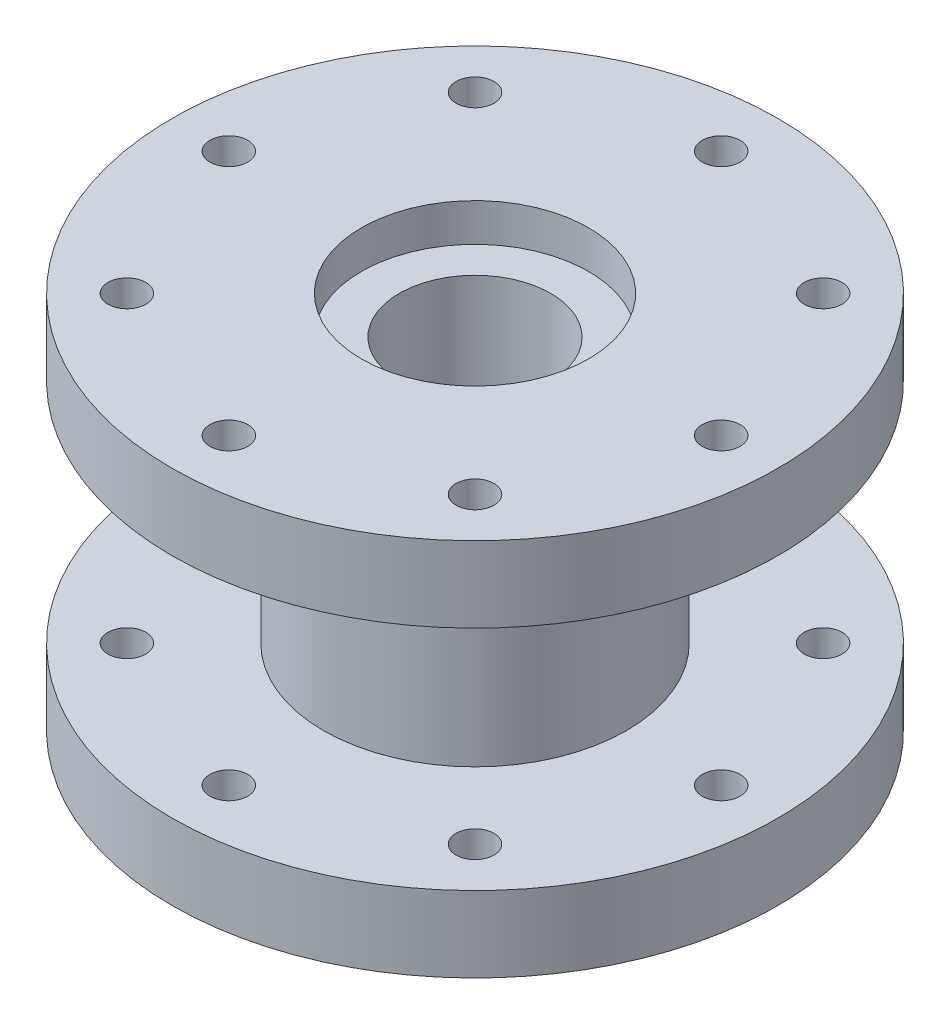
ISO-10303-21;
HEADER;
FILE_DESCRIPTION(('STEP AP214'),'2;1');
FILE_NAME('part.step','',(''),(''),'','','');
FILE_SCHEMA(('AUTOMOTIVE_DESIGN { 1 0 10303 214 1 1 1 1 }'));
ENDSEC;
DATA;
#1=APPLICATION_CONTEXT('core data for automotive mechanical design processes');
#2=APPLICATION_PROTOCOL_DEFINITION('international standard','automotive_design',2000,#1);
#3=PRODUCT_CONTEXT('',#1,'mechanical');
#4=PRODUCT('Part','Part','',(#3));
#5=PRODUCT_RELATED_PRODUCT_CATEGORY('part','',(#4));
#6=PRODUCT_DEFINITION_FORMATION('','',#4);
#7=PRODUCT_DEFINITION_CONTEXT('part definition',#1,'design');
#8=PRODUCT_DEFINITION('design','',#6,#7);
#9=PRODUCT_DEFINITION_SHAPE('','',#8);
#10=(LENGTH_UNIT() NAMED_UNIT(*) SI_UNIT(.MILLI.,.METRE.));
#11=(NAMED_UNIT(*) PLANE_ANGLE_UNIT() SI_UNIT($,.RADIAN.));
#12=(NAMED_UNIT(*) SI_UNIT($,.STERADIAN.) SOLID_ANGLE_UNIT());
#13=UNCERTAINTY_MEASURE_WITH_UNIT(LENGTH_MEASURE(1.E-05),#10,'distance_accuracy_value','');
#14=(GEOMETRIC_REPRESENTATION_CONTEXT(3) GLOBAL_UNCERTAINTY_ASSIGNED_CONTEXT((#13)) GLOBAL_UNIT_ASSIGNED_CONTEXT((#10,
#11,#12)) REPRESENTATION_CONTEXT('',''));
#15=CARTESIAN_POINT('',(0.,0.,0.));
#16=DIRECTION('',(0.,0.,1.));
#17=DIRECTION('',(1.,0.,0.));
#18=AXIS2_PLACEMENT_3D('',#15,#16,#17);
#19=CARTESIAN_POINT('',(19.05,57.15,0.));
#20=DIRECTION('',(0.,-1.,0.));
#21=DIRECTION('',(0.,0.,-1.));
#22=AXIS2_PLACEMENT_3D('',#19,#20,#21);
#23=PLANE('',#22);
#24=CARTESIAN_POINT('',(0.,57.15,0.));
#25=DIRECTION('',(0.,1.,0.));
#26=DIRECTION('',(0.,0.,1.));
#27=AXIS2_PLACEMENT_3D('',#24,#25,#26);
#28=CIRCLE('',#27,12.7);
#29=CARTESIAN_POINT('',(0.,57.15,12.7));
#30=VERTEX_POINT('',#29);
#31=EDGE_CURVE('E11',#30,#30,#28,.T.);
#32=ORIENTED_EDGE('',*,*,#31,.F.);
#33=EDGE_LOOP('',(#32));
#34=FACE_BOUND('',#33,.T.);
#35=CARTESIAN_POINT('',(0.,57.15,0.));
#36=DIRECTION('',(0.,1.,0.));
#37=DIRECTION('',(0.,0.,1.));
#38=AXIS2_PLACEMENT_3D('',#35,#36,#37);
#39=CIRCLE('',#38,19.05);
#40=CARTESIAN_POINT('',(0.,57.15,19.05));
#41=VERTEX_POINT('',#40);
#42=EDGE_CURVE('E110',#41,#41,#39,.T.);
#43=ORIENTED_EDGE('',*,*,#42,.T.);
#44=EDGE_LOOP('',(#43));
#45=FACE_BOUND('',#44,.T.);
#46=ADVANCED_FACE('F70',(#34,#45),#23,.F.);
#47=CARTESIAN_POINT('',(0.,117.328630251752,0.));
#48=DIRECTION('',(0.,1.,0.));
#49=DIRECTION('',(0.,0.,1.));
#50=AXIS2_PLACEMENT_3D('',#47,#48,#49);
#51=CYLINDRICAL_SURFACE('',#50,12.7);
#52=CARTESIAN_POINT('',(0.,6.34999999999999,0.));
#53=DIRECTION('',(0.,1.,0.));
#54=DIRECTION('',(0.,0.,1.));
#55=AXIS2_PLACEMENT_3D('',#52,#53,#54);
#56=CIRCLE('',#55,12.7);
#57=CARTESIAN_POINT('',(0.,6.34999999999999,12.7));
#58=VERTEX_POINT('',#57);
#59=EDGE_CURVE('E76',#58,#58,#56,.T.);
#60=ORIENTED_EDGE('',*,*,#59,.F.);
#61=EDGE_LOOP('',(#60));
#62=FACE_BOUND('',#61,.T.);
#63=ORIENTED_EDGE('',*,*,#31,.T.);
#64=EDGE_LOOP('',(#63));
#65=FACE_BOUND('',#64,.T.);
#66=ADVANCED_FACE('F276',(#62,#65),#51,.F.);
#67=CARTESIAN_POINT('',(12.7,6.35,0.));
#68=DIRECTION('',(0.,1.,0.));
#69=DIRECTION('',(0.,0.,1.));
#70=AXIS2_PLACEMENT_3D('',#67,#68,#69);
#71=PLANE('',#70);
#72=CARTESIAN_POINT('',(0.,6.34999999999999,0.));
#73=DIRECTION('',(0.,1.,0.));
#74=DIRECTION('',(0.,0.,1.));
#75=AXIS2_PLACEMENT_3D('',#72,#73,#74);
#76=CIRCLE('',#75,19.05);
#77=CARTESIAN_POINT('',(0.,6.34999999999999,19.05));
#78=VERTEX_POINT('',#77);
#79=EDGE_CURVE('E80',#78,#78,#76,.T.);
#80=ORIENTED_EDGE('',*,*,#79,.F.);
#81=EDGE_LOOP('',(#80));
#82=FACE_BOUND('',#81,.T.);
#83=ORIENTED_EDGE('',*,*,#59,.T.);
#84=EDGE_LOOP('',(#83));
#85=FACE_BOUND('',#84,.T.);
#86=ADVANCED_FACE('F271',(#82,#85),#71,.F.);
#87=CARTESIAN_POINT('',(0.,117.328630251752,0.));
#88=DIRECTION('',(0.,1.,0.));
#89=DIRECTION('',(0.,0.,1.));
#90=AXIS2_PLACEMENT_3D('',#87,#88,#89);
#91=CYLINDRICAL_SURFACE('',#90,19.05);
#92=CARTESIAN_POINT('',(0.,0.,0.));
#93=DIRECTION('',(0.,1.,0.));
#94=DIRECTION('',(0.,0.,1.));
#95=AXIS2_PLACEMENT_3D('',#92,#93,#94);
#96=CIRCLE('',#95,19.05);
#97=CARTESIAN_POINT('',(0.,0.,19.05));
#98=VERTEX_POINT('',#97);
#99=EDGE_CURVE('E84',#98,#98,#96,.T.);
#100=ORIENTED_EDGE('',*,*,#99,.F.);
#101=EDGE_LOOP('',(#100));
#102=FACE_BOUND('',#101,.T.);
#103=ORIENTED_EDGE('',*,*,#79,.T.);
#104=EDGE_LOOP('',(#103));
#105=FACE_BOUND('',#104,.T.);
#106=ADVANCED_FACE('F264',(#102,#105),#91,.F.);
#107=CARTESIAN_POINT('',(19.05,0.,0.));
#108=DIRECTION('',(0.,1.,0.));
#109=DIRECTION('',(0.,0.,1.));
#110=AXIS2_PLACEMENT_3D('',#107,#108,#109);
#111=PLANE('',#110);
#112=CARTESIAN_POINT('',(4.32332676782251E-13,0.,-41.275));
#113=DIRECTION('',(0.,1.,0.));
#114=DIRECTION('',(0.,0.,1.));
#115=AXIS2_PLACEMENT_3D('',#112,#113,#114);
#116=CIRCLE('',#115,3.17499999999999);
#117=CARTESIAN_POINT('',(4.32332676782251E-13,0.,-38.1));
#118=VERTEX_POINT('',#117);
#119=EDGE_CURVE('E187',#118,#118,#116,.T.);
#120=ORIENTED_EDGE('',*,*,#119,.T.);
#121=EDGE_LOOP('',(#120));
#122=FACE_BOUND('',#121,.T.);
#123=CARTESIAN_POINT('',(29.1858323934751,0.,-29.1858323934744));
#124=DIRECTION('',(0.,1.,0.));
#125=DIRECTION('',(0.,0.,1.));
#126=AXIS2_PLACEMENT_3D('',#123,#124,#125);
#127=CIRCLE('',#126,3.175);
#128=CARTESIAN_POINT('',(29.1858323934751,0.,-26.0108323934744));
#129=VERTEX_POINT('',#128);
#130=EDGE_CURVE('E181',#129,#129,#127,.T.);
#131=ORIENTED_EDGE('',*,*,#130,.T.);
#132=EDGE_LOOP('',(#131));
#133=FACE_BOUND('',#132,.T.);
#134=CARTESIAN_POINT('',(-1.4411089226075E-13,0.,41.275));
#135=DIRECTION('',(0.,1.,0.));
#136=DIRECTION('',(0.,0.,1.));
#137=AXIS2_PLACEMENT_3D('',#134,#135,#136);
#138=CIRCLE('',#137,3.17499999999999);
#139=CARTESIAN_POINT('',(-1.4411089226075E-13,0.,44.45));
#140=VERTEX_POINT('',#139);
#141=EDGE_CURVE('E175',#140,#140,#138,.T.);
#142=ORIENTED_EDGE('',*,*,#141,.T.);
#143=EDGE_LOOP('',(#142));
#144=FACE_BOUND('',#143,.T.);
#145=CARTESIAN_POINT('',(-41.275,0.,-2.88221784521501E-13));
#146=DIRECTION('',(0.,1.,0.));
#147=DIRECTION('',(0.,0.,1.));
#148=AXIS2_PLACEMENT_3D('',#145,#146,#147);
#149=CIRCLE('',#148,3.175);
#150=CARTESIAN_POINT('',(-41.275,0.,3.17499999999971));
#151=VERTEX_POINT('',#150);
#152=EDGE_CURVE('E168',#151,#151,#149,.T.);
#153=ORIENTED_EDGE('',*,*,#152,.T.);
#154=EDGE_LOOP('',(#153));
#155=FACE_BOUND('',#154,.T.);
#156=CARTESIAN_POINT('',(-29.1858323934749,0.,29.1858323934746));
#157=DIRECTION('',(0.,1.,0.));
#158=DIRECTION('',(0.,0.,1.));
#159=AXIS2_PLACEMENT_3D('',#156,#157,#158);
#160=CIRCLE('',#159,3.175);
#161=CARTESIAN_POINT('',(-29.1858323934749,0.,32.3608323934746));
#162=VERTEX_POINT('',#161);
#163=EDGE_CURVE('E204',#162,#162,#160,.T.);
#164=ORIENTED_EDGE('',*,*,#163,.T.);
#165=EDGE_LOOP('',(#164));
#166=FACE_BOUND('',#165,.T.);
#167=CARTESIAN_POINT('',(29.1858323934747,0.,29.1858323934748));
#168=DIRECTION('',(0.,1.,0.));
#169=DIRECTION('',(0.,0.,1.));
#170=AXIS2_PLACEMENT_3D('',#167,#168,#169);
#171=CIRCLE('',#170,3.175);
#172=CARTESIAN_POINT('',(29.1858323934747,0.,32.3608323934748));
#173=VERTEX_POINT('',#172);
#174=EDGE_CURVE('E198',#173,#173,#171,.T.);
#175=ORIENTED_EDGE('',*,*,#174,.T.);
#176=EDGE_LOOP('',(#175));
#177=FACE_BOUND('',#176,.T.);
#178=CARTESIAN_POINT('',(41.275,0.,0.));
#179=DIRECTION('',(0.,1.,0.));
#180=DIRECTION('',(0.,0.,1.));
#181=AXIS2_PLACEMENT_3D('',#178,#179,#180);
#182=CIRCLE('',#181,3.175);
#183=CARTESIAN_POINT('',(41.275,0.,3.175));
#184=VERTEX_POINT('',#183);
#185=EDGE_CURVE('E192',#184,#184,#182,.T.);
#186=ORIENTED_EDGE('',*,*,#185,.T.);
#187=EDGE_LOOP('',(#186));
#188=FACE_BOUND('',#187,.T.);
#189=CARTESIAN_POINT('',(-29.1858323934745,0.,-29.185832393475));
#190=DIRECTION('',(0.,1.,0.));
#191=DIRECTION('',(0.,0.,1.));
#192=AXIS2_PLACEMENT_3D('',#189,#190,#191);
#193=CIRCLE('',#192,3.175);
#194=CARTESIAN_POINT('',(-29.1858323934745,0.,-26.010832393475));
#195=VERTEX_POINT('',#194);
#196=EDGE_CURVE('E161',#195,#195,#193,.T.);
#197=ORIENTED_EDGE('',*,*,#196,.T.);
#198=EDGE_LOOP('',(#197));
#199=FACE_BOUND('',#198,.T.);
#200=CARTESIAN_POINT('',(0.,0.,0.));
#201=DIRECTION('',(0.,1.,0.));
#202=DIRECTION('',(0.,0.,1.));
#203=AXIS2_PLACEMENT_3D('',#200,#201,#202);
#204=CIRCLE('',#203,50.8);
#205=CARTESIAN_POINT('',(0.,0.,50.8));
#206=VERTEX_POINT('',#205);
#207=EDGE_CURVE('E89',#206,#206,#204,.T.);
#208=ORIENTED_EDGE('',*,*,#207,.F.);
#209=EDGE_LOOP('',(#208));
#210=FACE_BOUND('',#209,.T.);
#211=ORIENTED_EDGE('',*,*,#99,.T.);
#212=EDGE_LOOP('',(#211));
#213=FACE_BOUND('',#212,.T.);
#214=ADVANCED_FACE('F258',(#122,#133,#144,#155,#166,#177,#188,#199,#210,#213),#111,.F.);
#215=CARTESIAN_POINT('',(0.,117.328630251752,0.));
#216=DIRECTION('',(0.,1.,0.));
#217=DIRECTION('',(0.,0.,1.));
#218=AXIS2_PLACEMENT_3D('',#215,#216,#217);
#219=CYLINDRICAL_SURFACE('',#218,50.8);
#220=CARTESIAN_POINT('',(0.,12.7,0.));
#221=DIRECTION('',(0.,1.,0.));
#222=DIRECTION('',(0.,0.,1.));
#223=AXIS2_PLACEMENT_3D('',#220,#221,#222);
#224=CIRCLE('',#223,50.8);
#225=CARTESIAN_POINT('',(0.,12.7,50.8));
#226=VERTEX_POINT('',#225);
#227=EDGE_CURVE('E92',#226,#226,#224,.T.);
#228=ORIENTED_EDGE('',*,*,#227,.F.);
#229=EDGE_LOOP('',(#228));
#230=FACE_BOUND('',#229,.T.);
#231=ORIENTED_EDGE('',*,*,#207,.T.);
#232=EDGE_LOOP('',(#231));
#233=FACE_BOUND('',#232,.T.);
#234=ADVANCED_FACE('F251',(#230,#233),#219,.T.);
#235=CARTESIAN_POINT('',(50.8,12.7,0.));
#236=DIRECTION('',(0.,-1.,0.));
#237=DIRECTION('',(0.,0.,-1.));
#238=AXIS2_PLACEMENT_3D('',#235,#236,#237);
#239=PLANE('',#238);
#240=CARTESIAN_POINT('',(4.32332676782251E-13,12.7,-41.275));
#241=DIRECTION('',(0.,-1.,0.));
#242=DIRECTION('',(0.,0.,-1.));
#243=AXIS2_PLACEMENT_3D('',#240,#241,#242);
#244=CIRCLE('',#243,3.17499999999999);
#245=CARTESIAN_POINT('',(4.32332676782251E-13,12.7,-44.45));
#246=VERTEX_POINT('',#245);
#247=EDGE_CURVE('E113',#246,#246,#244,.T.);
#248=ORIENTED_EDGE('',*,*,#247,.T.);
#249=EDGE_LOOP('',(#248));
#250=FACE_BOUND('',#249,.T.);
#251=CARTESIAN_POINT('',(29.1858323934751,12.7,-29.1858323934744));
#252=DIRECTION('',(0.,-1.,0.));
#253=DIRECTION('',(0.,0.,-1.));
#254=AXIS2_PLACEMENT_3D('',#251,#252,#253);
#255=CIRCLE('',#254,3.175);
#256=CARTESIAN_POINT('',(29.1858323934751,12.7,-32.3608323934744));
#257=VERTEX_POINT('',#256);
#258=EDGE_CURVE('E119',#257,#257,#255,.T.);
#259=ORIENTED_EDGE('',*,*,#258,.T.);
#260=EDGE_LOOP('',(#259));
#261=FACE_BOUND('',#260,.T.);
#262=CARTESIAN_POINT('',(-1.4411089226075E-13,12.7,41.275));
#263=DIRECTION('',(0.,-1.,0.));
#264=DIRECTION('',(0.,0.,-1.));
#265=AXIS2_PLACEMENT_3D('',#262,#263,#264);
#266=CIRCLE('',#265,3.17499999999999);
#267=CARTESIAN_POINT('',(-1.4411089226075E-13,12.7,38.1));
#268=VERTEX_POINT('',#267);
#269=EDGE_CURVE('E125',#268,#268,#266,.T.);
#270=ORIENTED_EDGE('',*,*,#269,.T.);
#271=EDGE_LOOP('',(#270));
#272=FACE_BOUND('',#271,.T.);
#273=CARTESIAN_POINT('',(-41.275,12.7,-2.88221784521501E-13));
#274=DIRECTION('',(0.,-1.,0.));
#275=DIRECTION('',(0.,0.,-1.));
#276=AXIS2_PLACEMENT_3D('',#273,#274,#275);
#277=CIRCLE('',#276,3.175);
#278=CARTESIAN_POINT('',(-41.275,12.7,-3.17500000000029));
#279=VERTEX_POINT('',#278);
#280=EDGE_CURVE('E131',#279,#279,#277,.T.);
#281=ORIENTED_EDGE('',*,*,#280,.T.);
#282=EDGE_LOOP('',(#281));
#283=FACE_BOUND('',#282,.T.);
#284=CARTESIAN_POINT('',(-29.1858323934749,12.7,29.1858323934746));
#285=DIRECTION('',(0.,-1.,0.));
#286=DIRECTION('',(0.,0.,-1.));
#287=AXIS2_PLACEMENT_3D('',#284,#285,#286);
#288=CIRCLE('',#287,3.175);
#289=CARTESIAN_POINT('',(-29.1858323934749,12.7,26.0108323934746));
#290=VERTEX_POINT('',#289);
#291=EDGE_CURVE('E137',#290,#290,#288,.T.);
#292=ORIENTED_EDGE('',*,*,#291,.T.);
#293=EDGE_LOOP('',(#292));
#294=FACE_BOUND('',#293,.T.);
#295=CARTESIAN_POINT('',(29.1858323934747,12.7,29.1858323934748));
#296=DIRECTION('',(0.,-1.,0.));
#297=DIRECTION('',(0.,0.,-1.));
#298=AXIS2_PLACEMENT_3D('',#295,#296,#297);
#299=CIRCLE('',#298,3.175);
#300=CARTESIAN_POINT('',(29.1858323934747,12.7,26.0108323934748));
#301=VERTEX_POINT('',#300);
#302=EDGE_CURVE('E143',#301,#301,#299,.T.);
#303=ORIENTED_EDGE('',*,*,#302,.T.);
#304=EDGE_LOOP('',(#303));
#305=FACE_BOUND('',#304,.T.);
#306=CARTESIAN_POINT('',(41.275,12.7,0.));
#307=DIRECTION('',(0.,-1.,0.));
#308=DIRECTION('',(0.,0.,-1.));
#309=AXIS2_PLACEMENT_3D('',#306,#307,#308);
#310=CIRCLE('',#309,3.175);
#311=CARTESIAN_POINT('',(41.275,12.7,-3.175));
#312=VERTEX_POINT('',#311);
#313=EDGE_CURVE('E149',#312,#312,#310,.T.);
#314=ORIENTED_EDGE('',*,*,#313,.T.);
#315=EDGE_LOOP('',(#314));
#316=FACE_BOUND('',#315,.T.);
#317=CARTESIAN_POINT('',(-29.1858323934745,12.7,-29.185832393475));
#318=DIRECTION('',(0.,-1.,0.));
#319=DIRECTION('',(0.,0.,-1.));
#320=AXIS2_PLACEMENT_3D('',#317,#318,#319);
#321=CIRCLE('',#320,3.175);
#322=CARTESIAN_POINT('',(-29.1858323934745,12.7,-32.360832393475));
#323=VERTEX_POINT('',#322);
#324=EDGE_CURVE('E155',#323,#323,#321,.T.);
#325=ORIENTED_EDGE('',*,*,#324,.T.);
#326=EDGE_LOOP('',(#325));
#327=FACE_BOUND('',#326,.T.);
#328=CARTESIAN_POINT('',(0.,12.7,0.));
#329=DIRECTION('',(0.,1.,0.));
#330=DIRECTION('',(0.,0.,1.));
#331=AXIS2_PLACEMENT_3D('',#328,#329,#330);
#332=CIRCLE('',#331,25.4);
#333=CARTESIAN_POINT('',(0.,12.7,25.4));
#334=VERTEX_POINT('',#333);
#335=EDGE_CURVE('E95',#334,#334,#332,.T.);
#336=ORIENTED_EDGE('',*,*,#335,.F.);
#337=EDGE_LOOP('',(#336));
#338=FACE_BOUND('',#337,.T.);
#339=ORIENTED_EDGE('',*,*,#227,.T.);
#340=EDGE_LOOP('',(#339));
#341=FACE_BOUND('',#340,.T.);
#342=ADVANCED_FACE('F245',(#250,#261,#272,#283,#294,#305,#316,#327,#338,#341),#239,.F.);
#343=CARTESIAN_POINT('',(0.,117.328630251752,0.));
#344=DIRECTION('',(0.,1.,0.));
#345=DIRECTION('',(0.,0.,1.));
#346=AXIS2_PLACEMENT_3D('',#343,#344,#345);
#347=CYLINDRICAL_SURFACE('',#346,25.4);
#348=CARTESIAN_POINT('',(0.,50.8,0.));
#349=DIRECTION('',(0.,1.,0.));
#350=DIRECTION('',(0.,0.,1.));
#351=AXIS2_PLACEMENT_3D('',#348,#349,#350);
#352=CIRCLE('',#351,25.4);
#353=CARTESIAN_POINT('',(0.,50.8,25.4));
#354=VERTEX_POINT('',#353);
#355=EDGE_CURVE('E98',#354,#354,#352,.T.);
#356=ORIENTED_EDGE('',*,*,#355,.F.);
#357=EDGE_LOOP('',(#356));
#358=FACE_BOUND('',#357,.T.);
#359=ORIENTED_EDGE('',*,*,#335,.T.);
#360=EDGE_LOOP('',(#359));
#361=FACE_BOUND('',#360,.T.);
#362=ADVANCED_FACE('F238',(#358,#361),#347,.T.);
#363=CARTESIAN_POINT('',(25.4,50.8,0.));
#364=DIRECTION('',(0.,1.,0.));
#365=DIRECTION('',(0.,0.,1.));
#366=AXIS2_PLACEMENT_3D('',#363,#364,#365);
#367=PLANE('',#366);
#368=CARTESIAN_POINT('',(4.32332676782251E-13,50.8,-41.275));
#369=DIRECTION('',(0.,1.,0.));
#370=DIRECTION('',(0.,0.,1.));
#371=AXIS2_PLACEMENT_3D('',#368,#369,#370);
#372=CIRCLE('',#371,3.17499999999999);
#373=CARTESIAN_POINT('',(4.32332676782251E-13,50.8,-38.1));
#374=VERTEX_POINT('',#373);
#375=EDGE_CURVE('E116',#374,#374,#372,.T.);
#376=ORIENTED_EDGE('',*,*,#375,.T.);
#377=EDGE_LOOP('',(#376));
#378=FACE_BOUND('',#377,.T.);
#379=CARTESIAN_POINT('',(29.1858323934751,50.8,-29.1858323934744));
#380=DIRECTION('',(0.,1.,0.));
#381=DIRECTION('',(0.,0.,1.));
#382=AXIS2_PLACEMENT_3D('',#379,#380,#381);
#383=CIRCLE('',#382,3.175);
#384=CARTESIAN_POINT('',(29.1858323934751,50.8,-26.0108323934744));
#385=VERTEX_POINT('',#384);
#386=EDGE_CURVE('E122',#385,#385,#383,.T.);
#387=ORIENTED_EDGE('',*,*,#386,.T.);
#388=EDGE_LOOP('',(#387));
#389=FACE_BOUND('',#388,.T.);
#390=CARTESIAN_POINT('',(-1.4411089226075E-13,50.8,41.275));
#391=DIRECTION('',(0.,1.,0.));
#392=DIRECTION('',(0.,0.,1.));
#393=AXIS2_PLACEMENT_3D('',#390,#391,#392);
#394=CIRCLE('',#393,3.17499999999999);
#395=CARTESIAN_POINT('',(-1.4411089226075E-13,50.8,44.45));
#396=VERTEX_POINT('',#395);
#397=EDGE_CURVE('E128',#396,#396,#394,.T.);
#398=ORIENTED_EDGE('',*,*,#397,.T.);
#399=EDGE_LOOP('',(#398));
#400=FACE_BOUND('',#399,.T.);
#401=CARTESIAN_POINT('',(-41.275,50.8,-2.88221784521501E-13));
#402=DIRECTION('',(0.,1.,0.));
#403=DIRECTION('',(0.,0.,1.));
#404=AXIS2_PLACEMENT_3D('',#401,#402,#403);
#405=CIRCLE('',#404,3.175);
#406=CARTESIAN_POINT('',(-41.275,50.8,3.17499999999971));
#407=VERTEX_POINT('',#406);
#408=EDGE_CURVE('E134',#407,#407,#405,.T.);
#409=ORIENTED_EDGE('',*,*,#408,.T.);
#410=EDGE_LOOP('',(#409));
#411=FACE_BOUND('',#410,.T.);
#412=CARTESIAN_POINT('',(-29.1858323934749,50.8,29.1858323934746));
#413=DIRECTION('',(0.,1.,0.));
#414=DIRECTION('',(0.,0.,1.));
#415=AXIS2_PLACEMENT_3D('',#412,#413,#414);
#416=CIRCLE('',#415,3.175);
#417=CARTESIAN_POINT('',(-29.1858323934749,50.8,32.3608323934746));
#418=VERTEX_POINT('',#417);
#419=EDGE_CURVE('E140',#418,#418,#416,.T.);
#420=ORIENTED_EDGE('',*,*,#419,.T.);
#421=EDGE_LOOP('',(#420));
#422=FACE_BOUND('',#421,.T.);
#423=CARTESIAN_POINT('',(29.1858323934747,50.8,29.1858323934748));
#424=DIRECTION('',(0.,1.,0.));
#425=DIRECTION('',(0.,0.,1.));
#426=AXIS2_PLACEMENT_3D('',#423,#424,#425);
#427=CIRCLE('',#426,3.175);
#428=CARTESIAN_POINT('',(29.1858323934747,50.8,32.3608323934748));
#429=VERTEX_POINT('',#428);
#430=EDGE_CURVE('E146',#429,#429,#427,.T.);
#431=ORIENTED_EDGE('',*,*,#430,.T.);
#432=EDGE_LOOP('',(#431));
#433=FACE_BOUND('',#432,.T.);
#434=CARTESIAN_POINT('',(41.275,50.8,0.));
#435=DIRECTION('',(0.,1.,0.));
#436=DIRECTION('',(0.,0.,1.));
#437=AXIS2_PLACEMENT_3D('',#434,#435,#436);
#438=CIRCLE('',#437,3.175);
#439=CARTESIAN_POINT('',(41.275,50.8,3.175));
#440=VERTEX_POINT('',#439);
#441=EDGE_CURVE('E152',#440,#440,#438,.T.);
#442=ORIENTED_EDGE('',*,*,#441,.T.);
#443=EDGE_LOOP('',(#442));
#444=FACE_BOUND('',#443,.T.);
#445=CARTESIAN_POINT('',(-29.1858323934745,50.8,-29.185832393475));
#446=DIRECTION('',(0.,1.,0.));
#447=DIRECTION('',(0.,0.,1.));
#448=AXIS2_PLACEMENT_3D('',#445,#446,#447);
#449=CIRCLE('',#448,3.175);
#450=CARTESIAN_POINT('',(-29.1858323934745,50.8,-26.010832393475));
#451=VERTEX_POINT('',#450);
#452=EDGE_CURVE('E158',#451,#451,#449,.T.);
#453=ORIENTED_EDGE('',*,*,#452,.T.);
#454=EDGE_LOOP('',(#453));
#455=FACE_BOUND('',#454,.T.);
#456=CARTESIAN_POINT('',(0.,50.8,0.));
#457=DIRECTION('',(0.,1.,0.));
#458=DIRECTION('',(0.,0.,1.));
#459=AXIS2_PLACEMENT_3D('',#456,#457,#458);
#460=CIRCLE('',#459,50.8);
#461=CARTESIAN_POINT('',(0.,50.8,50.8));
#462=VERTEX_POINT('',#461);
#463=EDGE_CURVE('E101',#462,#462,#460,.T.);
#464=ORIENTED_EDGE('',*,*,#463,.F.);
#465=EDGE_LOOP('',(#464));
#466=FACE_BOUND('',#465,.T.);
#467=ORIENTED_EDGE('',*,*,#355,.T.);
#468=EDGE_LOOP('',(#467));
#469=FACE_BOUND('',#468,.T.);
#470=ADVANCED_FACE('F232',(#378,#389,#400,#411,#422,#433,#444,#455,#466,#469),#367,.F.);
#471=CARTESIAN_POINT('',(0.,117.328630251752,0.));
#472=DIRECTION('',(0.,1.,0.));
#473=DIRECTION('',(0.,0.,1.));
#474=AXIS2_PLACEMENT_3D('',#471,#472,#473);
#475=CYLINDRICAL_SURFACE('',#474,50.8);
#476=CARTESIAN_POINT('',(0.,63.5,0.));
#477=DIRECTION('',(0.,1.,0.));
#478=DIRECTION('',(0.,0.,1.));
#479=AXIS2_PLACEMENT_3D('',#476,#477,#478);
#480=CIRCLE('',#479,50.8);
#481=CARTESIAN_POINT('',(0.,63.5,50.8));
#482=VERTEX_POINT('',#481);
#483=EDGE_CURVE('E104',#482,#482,#480,.T.);
#484=ORIENTED_EDGE('',*,*,#483,.F.);
#485=EDGE_LOOP('',(#484));
#486=FACE_BOUND('',#485,.T.);
#487=ORIENTED_EDGE('',*,*,#463,.T.);
#488=EDGE_LOOP('',(#487));
#489=FACE_BOUND('',#488,.T.);
#490=ADVANCED_FACE('F217',(#486,#489),#475,.T.);
#491=CARTESIAN_POINT('',(50.8,63.5,0.));
#492=DIRECTION('',(0.,-1.,0.));
#493=DIRECTION('',(0.,0.,-1.));
#494=AXIS2_PLACEMENT_3D('',#491,#492,#493);
#495=PLANE('',#494);
#496=CARTESIAN_POINT('',(4.32332676782251E-13,63.5,-41.275));
#497=DIRECTION('',(0.,1.,0.));
#498=DIRECTION('',(0.,0.,1.));
#499=AXIS2_PLACEMENT_3D('',#496,#497,#498);
#500=CIRCLE('',#499,3.17499999999999);
#501=CARTESIAN_POINT('',(4.32332676782251E-13,63.5,-38.1));
#502=VERTEX_POINT('',#501);
#503=EDGE_CURVE('E165',#502,#502,#500,.T.);
#504=ORIENTED_EDGE('',*,*,#503,.F.);
#505=EDGE_LOOP('',(#504));
#506=FACE_BOUND('',#505,.T.);
#507=CARTESIAN_POINT('',(29.1858323934751,63.5,-29.1858323934744));
#508=DIRECTION('',(0.,1.,0.));
#509=DIRECTION('',(0.,0.,1.));
#510=AXIS2_PLACEMENT_3D('',#507,#508,#509);
#511=CIRCLE('',#510,3.175);
#512=CARTESIAN_POINT('',(29.1858323934751,63.5,-26.0108323934744));
#513=VERTEX_POINT('',#512);
#514=EDGE_CURVE('E184',#513,#513,#511,.T.);
#515=ORIENTED_EDGE('',*,*,#514,.F.);
#516=EDGE_LOOP('',(#515));
#517=FACE_BOUND('',#516,.T.);
#518=CARTESIAN_POINT('',(-1.4411089226075E-13,63.5,41.275));
#519=DIRECTION('',(0.,1.,0.));
#520=DIRECTION('',(0.,0.,1.));
#521=AXIS2_PLACEMENT_3D('',#518,#519,#520);
#522=CIRCLE('',#521,3.17499999999999);
#523=CARTESIAN_POINT('',(-1.4411089226075E-13,63.5,44.45));
#524=VERTEX_POINT('',#523);
#525=EDGE_CURVE('E178',#524,#524,#522,.T.);
#526=ORIENTED_EDGE('',*,*,#525,.F.);
#527=EDGE_LOOP('',(#526));
#528=FACE_BOUND('',#527,.T.);
#529=CARTESIAN_POINT('',(-41.275,63.5,-2.88221784521501E-13));
#530=DIRECTION('',(0.,1.,0.));
#531=DIRECTION('',(0.,0.,1.));
#532=AXIS2_PLACEMENT_3D('',#529,#530,#531);
#533=CIRCLE('',#532,3.175);
#534=CARTESIAN_POINT('',(-41.275,63.5,3.17499999999971));
#535=VERTEX_POINT('',#534);
#536=EDGE_CURVE('E171',#535,#535,#533,.T.);
#537=ORIENTED_EDGE('',*,*,#536,.F.);
#538=EDGE_LOOP('',(#537));
#539=FACE_BOUND('',#538,.T.);
#540=CARTESIAN_POINT('',(-29.1858323934749,63.5,29.1858323934746));
#541=DIRECTION('',(0.,1.,0.));
#542=DIRECTION('',(0.,0.,1.));
#543=AXIS2_PLACEMENT_3D('',#540,#541,#542);
#544=CIRCLE('',#543,3.175);
#545=CARTESIAN_POINT('',(-29.1858323934749,63.5,32.3608323934746));
#546=VERTEX_POINT('',#545);
#547=EDGE_CURVE('E172',#546,#546,#544,.T.);
#548=ORIENTED_EDGE('',*,*,#547,.F.);
#549=EDGE_LOOP('',(#548));
#550=FACE_BOUND('',#549,.T.);
#551=CARTESIAN_POINT('',(29.1858323934747,63.5,29.1858323934748));
#552=DIRECTION('',(0.,1.,0.));
#553=DIRECTION('',(0.,0.,1.));
#554=AXIS2_PLACEMENT_3D('',#551,#552,#553);
#555=CIRCLE('',#554,3.175);
#556=CARTESIAN_POINT('',(29.1858323934747,63.5,32.3608323934748));
#557=VERTEX_POINT('',#556);
#558=EDGE_CURVE('E201',#557,#557,#555,.T.);
#559=ORIENTED_EDGE('',*,*,#558,.F.);
#560=EDGE_LOOP('',(#559));
#561=FACE_BOUND('',#560,.T.);
#562=CARTESIAN_POINT('',(41.275,63.5,0.));
#563=DIRECTION('',(0.,1.,0.));
#564=DIRECTION('',(0.,0.,1.));
#565=AXIS2_PLACEMENT_3D('',#562,#563,#564);
#566=CIRCLE('',#565,3.175);
#567=CARTESIAN_POINT('',(41.275,63.5,3.175));
#568=VERTEX_POINT('',#567);
#569=EDGE_CURVE('E195',#568,#568,#566,.T.);
#570=ORIENTED_EDGE('',*,*,#569,.F.);
#571=EDGE_LOOP('',(#570));
#572=FACE_BOUND('',#571,.T.);
#573=CARTESIAN_POINT('',(-29.1858323934745,63.5,-29.185832393475));
#574=DIRECTION('',(0.,1.,0.));
#575=DIRECTION('',(0.,0.,1.));
#576=AXIS2_PLACEMENT_3D('',#573,#574,#575);
#577=CIRCLE('',#576,3.175);
#578=CARTESIAN_POINT('',(-29.1858323934745,63.5,-26.010832393475));
#579=VERTEX_POINT('',#578);
#580=EDGE_CURVE('E162',#579,#579,#577,.T.);
#581=ORIENTED_EDGE('',*,*,#580,.F.);
#582=EDGE_LOOP('',(#581));
#583=FACE_BOUND('',#582,.T.);
#584=CARTESIAN_POINT('',(0.,63.5,0.));
#585=DIRECTION('',(0.,1.,0.));
#586=DIRECTION('',(0.,0.,1.));
#587=AXIS2_PLACEMENT_3D('',#584,#585,#586);
#588=CIRCLE('',#587,19.05);
#589=CARTESIAN_POINT('',(0.,63.5,19.05));
#590=VERTEX_POINT('',#589);
#591=EDGE_CURVE('E107',#590,#590,#588,.T.);
#592=ORIENTED_EDGE('',*,*,#591,.F.);
#593=EDGE_LOOP('',(#592));
#594=FACE_BOUND('',#593,.T.);
#595=ORIENTED_EDGE('',*,*,#483,.T.);
#596=EDGE_LOOP('',(#595));
#597=FACE_BOUND('',#596,.T.);
#598=ADVANCED_FACE('F213',(#506,#517,#528,#539,#550,#561,#572,#583,#594,#597),#495,.F.);
#599=CARTESIAN_POINT('',(0.,117.328630251752,0.));
#600=DIRECTION('',(0.,1.,0.));
#601=DIRECTION('',(0.,0.,1.));
#602=AXIS2_PLACEMENT_3D('',#599,#600,#601);
#603=CYLINDRICAL_SURFACE('',#602,19.05);
#604=ORIENTED_EDGE('',*,*,#42,.F.);
#605=EDGE_LOOP('',(#604));
#606=FACE_BOUND('',#605,.T.);
#607=ORIENTED_EDGE('',*,*,#591,.T.);
#608=EDGE_LOOP('',(#607));
#609=FACE_BOUND('',#608,.T.);
#610=ADVANCED_FACE('F216',(#606,#609),#603,.F.);
#611=CARTESIAN_POINT('',(-29.1858323934745,0.,-29.185832393475));
#612=DIRECTION('',(0.,1.,0.));
#613=DIRECTION('',(0.,0.,1.));
#614=AXIS2_PLACEMENT_3D('',#611,#612,#613);
#615=CYLINDRICAL_SURFACE('',#614,3.175);
#616=ORIENTED_EDGE('',*,*,#580,.T.);
#617=EDGE_LOOP('',(#616));
#618=FACE_BOUND('',#617,.T.);
#619=ORIENTED_EDGE('',*,*,#452,.F.);
#620=EDGE_LOOP('',(#619));
#621=FACE_BOUND('',#620,.T.);
#622=ADVANCED_FACE('F291',(#618,#621),#615,.F.);
#623=CARTESIAN_POINT('',(41.275,0.,0.));
#624=DIRECTION('',(0.,1.,0.));
#625=DIRECTION('',(0.,0.,1.));
#626=AXIS2_PLACEMENT_3D('',#623,#624,#625);
#627=CYLINDRICAL_SURFACE('',#626,3.175);
#628=ORIENTED_EDGE('',*,*,#569,.T.);
#629=EDGE_LOOP('',(#628));
#630=FACE_BOUND('',#629,.T.);
#631=ORIENTED_EDGE('',*,*,#441,.F.);
#632=EDGE_LOOP('',(#631));
#633=FACE_BOUND('',#632,.T.);
#634=ADVANCED_FACE('F296',(#630,#633),#627,.F.);
#635=CARTESIAN_POINT('',(29.1858323934747,0.,29.1858323934748));
#636=DIRECTION('',(0.,1.,0.));
#637=DIRECTION('',(0.,0.,1.));
#638=AXIS2_PLACEMENT_3D('',#635,#636,#637);
#639=CYLINDRICAL_SURFACE('',#638,3.175);
#640=ORIENTED_EDGE('',*,*,#558,.T.);
#641=EDGE_LOOP('',(#640));
#642=FACE_BOUND('',#641,.T.);
#643=ORIENTED_EDGE('',*,*,#430,.F.);
#644=EDGE_LOOP('',(#643));
#645=FACE_BOUND('',#644,.T.);
#646=ADVANCED_FACE('F332',(#642,#645),#639,.F.);
#647=CARTESIAN_POINT('',(-29.1858323934749,0.,29.1858323934746));
#648=DIRECTION('',(0.,1.,0.));
#649=DIRECTION('',(0.,0.,1.));
#650=AXIS2_PLACEMENT_3D('',#647,#648,#649);
#651=CYLINDRICAL_SURFACE('',#650,3.175);
#652=ORIENTED_EDGE('',*,*,#547,.T.);
#653=EDGE_LOOP('',(#652));
#654=FACE_BOUND('',#653,.T.);
#655=ORIENTED_EDGE('',*,*,#419,.F.);
#656=EDGE_LOOP('',(#655));
#657=FACE_BOUND('',#656,.T.);
#658=ADVANCED_FACE('F210',(#654,#657),#651,.F.);
#659=CARTESIAN_POINT('',(-41.275,0.,-2.88221784521501E-13));
#660=DIRECTION('',(0.,1.,0.));
#661=DIRECTION('',(0.,0.,1.));
#662=AXIS2_PLACEMENT_3D('',#659,#660,#661);
#663=CYLINDRICAL_SURFACE('',#662,3.175);
#664=ORIENTED_EDGE('',*,*,#536,.T.);
#665=EDGE_LOOP('',(#664));
#666=FACE_BOUND('',#665,.T.);
#667=ORIENTED_EDGE('',*,*,#408,.F.);
#668=EDGE_LOOP('',(#667));
#669=FACE_BOUND('',#668,.T.);
#670=ADVANCED_FACE('F311',(#666,#669),#663,.F.);
#671=CARTESIAN_POINT('',(-1.4411089226075E-13,0.,41.275));
#672=DIRECTION('',(0.,1.,0.));
#673=DIRECTION('',(0.,0.,1.));
#674=AXIS2_PLACEMENT_3D('',#671,#672,#673);
#675=CYLINDRICAL_SURFACE('',#674,3.17499999999999);
#676=ORIENTED_EDGE('',*,*,#525,.T.);
#677=EDGE_LOOP('',(#676));
#678=FACE_BOUND('',#677,.T.);
#679=ORIENTED_EDGE('',*,*,#397,.F.);
#680=EDGE_LOOP('',(#679));
#681=FACE_BOUND('',#680,.T.);
#682=ADVANCED_FACE('F316',(#678,#681),#675,.F.);
#683=CARTESIAN_POINT('',(29.1858323934751,0.,-29.1858323934744));
#684=DIRECTION('',(0.,1.,0.));
#685=DIRECTION('',(0.,0.,1.));
#686=AXIS2_PLACEMENT_3D('',#683,#684,#685);
#687=CYLINDRICAL_SURFACE('',#686,3.175);
#688=ORIENTED_EDGE('',*,*,#514,.T.);
#689=EDGE_LOOP('',(#688));
#690=FACE_BOUND('',#689,.T.);
#691=ORIENTED_EDGE('',*,*,#386,.F.);
#692=EDGE_LOOP('',(#691));
#693=FACE_BOUND('',#692,.T.);
#694=ADVANCED_FACE('F321',(#690,#693),#687,.F.);
#695=CARTESIAN_POINT('',(4.32332676782251E-13,0.,-41.275));
#696=DIRECTION('',(0.,1.,0.));
#697=DIRECTION('',(0.,0.,1.));
#698=AXIS2_PLACEMENT_3D('',#695,#696,#697);
#699=CYLINDRICAL_SURFACE('',#698,3.17499999999999);
#700=ORIENTED_EDGE('',*,*,#503,.T.);
#701=EDGE_LOOP('',(#700));
#702=FACE_BOUND('',#701,.T.);
#703=ORIENTED_EDGE('',*,*,#375,.F.);
#704=EDGE_LOOP('',(#703));
#705=FACE_BOUND('',#704,.T.);
#706=ADVANCED_FACE('F303',(#702,#705),#699,.F.);
#707=ORIENTED_EDGE('',*,*,#196,.F.);
#708=EDGE_LOOP('',(#707));
#709=FACE_BOUND('',#708,.T.);
#710=ORIENTED_EDGE('',*,*,#324,.F.);
#711=EDGE_LOOP('',(#710));
#712=FACE_BOUND('',#711,.T.);
#713=ADVANCED_FACE('F299',(#709,#712),#615,.F.);
#714=ORIENTED_EDGE('',*,*,#185,.F.);
#715=EDGE_LOOP('',(#714));
#716=FACE_BOUND('',#715,.T.);
#717=ORIENTED_EDGE('',*,*,#313,.F.);
#718=EDGE_LOOP('',(#717));
#719=FACE_BOUND('',#718,.T.);
#720=ADVANCED_FACE('F302',(#716,#719),#627,.F.);
#721=ORIENTED_EDGE('',*,*,#174,.F.);
#722=EDGE_LOOP('',(#721));
#723=FACE_BOUND('',#722,.T.);
#724=ORIENTED_EDGE('',*,*,#302,.F.);
#725=EDGE_LOOP('',(#724));
#726=FACE_BOUND('',#725,.T.);
#727=ADVANCED_FACE('F327',(#723,#726),#639,.F.);
#728=ORIENTED_EDGE('',*,*,#163,.F.);
#729=EDGE_LOOP('',(#728));
#730=FACE_BOUND('',#729,.T.);
#731=ORIENTED_EDGE('',*,*,#291,.F.);
#732=EDGE_LOOP('',(#731));
#733=FACE_BOUND('',#732,.T.);
#734=ADVANCED_FACE('F309',(#730,#733),#651,.F.);
#735=ORIENTED_EDGE('',*,*,#152,.F.);
#736=EDGE_LOOP('',(#735));
#737=FACE_BOUND('',#736,.T.);
#738=ORIENTED_EDGE('',*,*,#280,.F.);
#739=EDGE_LOOP('',(#738));
#740=FACE_BOUND('',#739,.T.);
#741=ADVANCED_FACE('F305',(#737,#740),#663,.F.);
#742=ORIENTED_EDGE('',*,*,#141,.F.);
#743=EDGE_LOOP('',(#742));
#744=FACE_BOUND('',#743,.T.);
#745=ORIENTED_EDGE('',*,*,#269,.F.);
#746=EDGE_LOOP('',(#745));
#747=FACE_BOUND('',#746,.T.);
#748=ADVANCED_FACE('F308',(#744,#747),#675,.F.);
#749=ORIENTED_EDGE('',*,*,#130,.F.);
#750=EDGE_LOOP('',(#749));
#751=FACE_BOUND('',#750,.T.);
#752=ORIENTED_EDGE('',*,*,#258,.F.);
#753=EDGE_LOOP('',(#752));
#754=FACE_BOUND('',#753,.T.);
#755=ADVANCED_FACE('F314',(#751,#754),#687,.F.);
#756=ORIENTED_EDGE('',*,*,#119,.F.);
#757=EDGE_LOOP('',(#756));
#758=FACE_BOUND('',#757,.T.);
#759=ORIENTED_EDGE('',*,*,#247,.F.);
#760=EDGE_LOOP('',(#759));
#761=FACE_BOUND('',#760,.T.);
#762=ADVANCED_FACE('F319',(#758,#761),#699,.F.);
#763=CLOSED_SHELL('',(#46,#66,#86,#106,#214,#234,#342,#362,#470,#490,#598,#610,#622,#634,#646,
#658,#670,#682,#694,#706,#713,#720,#727,#734,#741,#748,#755,#762));
#764=MANIFOLD_SOLID_BREP('B2',#763);
#765=ADVANCED_BREP_SHAPE_REPRESENTATION('',(#18,#764),#14);
#766=SHAPE_DEFINITION_REPRESENTATION(#9,#765);
ENDSEC;
END-ISO-10303-21;
